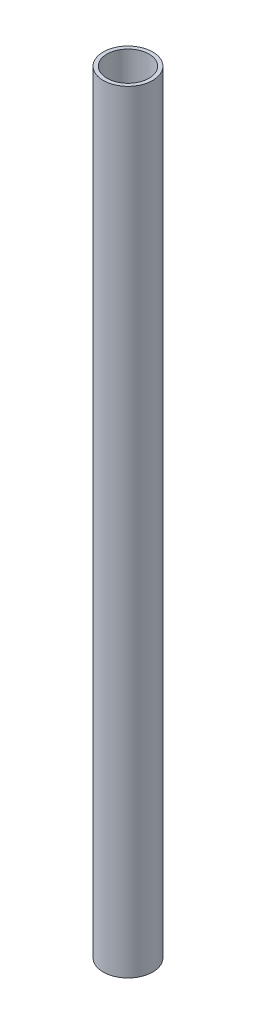
ISO-10303-21;
HEADER;
FILE_DESCRIPTION(('STEP AP214'),'2;1');
FILE_NAME('part.step','',(''),(''),'','','');
FILE_SCHEMA(('AUTOMOTIVE_DESIGN { 1 0 10303 214 1 1 1 1 }'));
ENDSEC;
DATA;
#1=APPLICATION_CONTEXT('core data for automotive mechanical design processes');
#2=APPLICATION_PROTOCOL_DEFINITION('international standard','automotive_design',2000,#1);
#3=PRODUCT_CONTEXT('',#1,'mechanical');
#4=PRODUCT('Part','Part','',(#3));
#5=PRODUCT_RELATED_PRODUCT_CATEGORY('part','',(#4));
#6=PRODUCT_DEFINITION_FORMATION('','',#4);
#7=PRODUCT_DEFINITION_CONTEXT('part definition',#1,'design');
#8=PRODUCT_DEFINITION('design','',#6,#7);
#9=PRODUCT_DEFINITION_SHAPE('','',#8);
#10=(LENGTH_UNIT() NAMED_UNIT(*) SI_UNIT(.MILLI.,.METRE.));
#11=(NAMED_UNIT(*) PLANE_ANGLE_UNIT() SI_UNIT($,.RADIAN.));
#12=(NAMED_UNIT(*) SI_UNIT($,.STERADIAN.) SOLID_ANGLE_UNIT());
#13=UNCERTAINTY_MEASURE_WITH_UNIT(LENGTH_MEASURE(1.E-05),#10,'distance_accuracy_value','');
#14=(GEOMETRIC_REPRESENTATION_CONTEXT(3) GLOBAL_UNCERTAINTY_ASSIGNED_CONTEXT((#13)) GLOBAL_UNIT_ASSIGNED_CONTEXT((#10,
#11,#12)) REPRESENTATION_CONTEXT('',''));
#15=CARTESIAN_POINT('',(0.,0.,0.));
#16=DIRECTION('',(0.,0.,1.));
#17=DIRECTION('',(1.,0.,0.));
#18=AXIS2_PLACEMENT_3D('',#15,#16,#17);
#19=CARTESIAN_POINT('',(0.,500.,0.));
#20=DIRECTION('',(0.,1.,0.));
#21=DIRECTION('',(0.,0.,1.));
#22=AXIS2_PLACEMENT_3D('',#19,#20,#21);
#23=PLANE('',#22);
#24=CARTESIAN_POINT('',(0.,500.,0.));
#25=DIRECTION('',(0.,1.,0.));
#26=DIRECTION('',(0.,0.,1.));
#27=AXIS2_PLACEMENT_3D('',#24,#25,#26);
#28=CIRCLE('',#27,16.);
#29=CARTESIAN_POINT('',(0.,500.,16.));
#30=VERTEX_POINT('',#29);
#31=EDGE_CURVE('E10',#30,#30,#28,.T.);
#32=ORIENTED_EDGE('',*,*,#31,.T.);
#33=EDGE_LOOP('',(#32));
#34=FACE_BOUND('',#33,.T.);
#35=CARTESIAN_POINT('',(0.,500.,0.));
#36=DIRECTION('',(0.,1.,0.));
#37=DIRECTION('',(0.,0.,1.));
#38=AXIS2_PLACEMENT_3D('',#35,#36,#37);
#39=CIRCLE('',#38,13.6);
#40=CARTESIAN_POINT('',(0.,500.,13.6));
#41=VERTEX_POINT('',#40);
#42=EDGE_CURVE('E48',#41,#41,#39,.T.);
#43=ORIENTED_EDGE('',*,*,#42,.F.);
#44=EDGE_LOOP('',(#43));
#45=FACE_BOUND('',#44,.T.);
#46=ADVANCED_FACE('F37',(#34,#45),#23,.T.);
#47=CARTESIAN_POINT('',(0.,0.,0.));
#48=DIRECTION('',(0.,1.,0.));
#49=DIRECTION('',(0.,0.,1.));
#50=AXIS2_PLACEMENT_3D('',#47,#48,#49);
#51=PLANE('',#50);
#52=CARTESIAN_POINT('',(0.,0.,0.));
#53=DIRECTION('',(0.,1.,0.));
#54=DIRECTION('',(0.,0.,1.));
#55=AXIS2_PLACEMENT_3D('',#52,#53,#54);
#56=CIRCLE('',#55,16.);
#57=CARTESIAN_POINT('',(0.,0.,16.));
#58=VERTEX_POINT('',#57);
#59=EDGE_CURVE('E41',#58,#58,#56,.T.);
#60=ORIENTED_EDGE('',*,*,#59,.F.);
#61=EDGE_LOOP('',(#60));
#62=FACE_BOUND('',#61,.T.);
#63=CARTESIAN_POINT('',(0.,0.,0.));
#64=DIRECTION('',(0.,1.,0.));
#65=DIRECTION('',(0.,0.,1.));
#66=AXIS2_PLACEMENT_3D('',#63,#64,#65);
#67=CIRCLE('',#66,13.6);
#68=CARTESIAN_POINT('',(0.,0.,13.6));
#69=VERTEX_POINT('',#68);
#70=EDGE_CURVE('E50',#69,#69,#67,.T.);
#71=ORIENTED_EDGE('',*,*,#70,.T.);
#72=EDGE_LOOP('',(#71));
#73=FACE_BOUND('',#72,.T.);
#74=ADVANCED_FACE('F60',(#62,#73),#51,.F.);
#75=CARTESIAN_POINT('',(0.,500.,0.));
#76=DIRECTION('',(0.,-1.,0.));
#77=DIRECTION('',(0.,0.,-1.));
#78=AXIS2_PLACEMENT_3D('',#75,#76,#77);
#79=CYLINDRICAL_SURFACE('',#78,16.);
#80=ORIENTED_EDGE('',*,*,#31,.F.);
#81=EDGE_LOOP('',(#80));
#82=FACE_BOUND('',#81,.T.);
#83=ORIENTED_EDGE('',*,*,#59,.T.);
#84=EDGE_LOOP('',(#83));
#85=FACE_BOUND('',#84,.T.);
#86=ADVANCED_FACE('F39',(#82,#85),#79,.T.);
#87=CARTESIAN_POINT('',(0.,500.,0.));
#88=DIRECTION('',(0.,-1.,0.));
#89=DIRECTION('',(0.,0.,-1.));
#90=AXIS2_PLACEMENT_3D('',#87,#88,#89);
#91=CYLINDRICAL_SURFACE('',#90,13.6);
#92=ORIENTED_EDGE('',*,*,#42,.T.);
#93=EDGE_LOOP('',(#92));
#94=FACE_BOUND('',#93,.T.);
#95=ORIENTED_EDGE('',*,*,#70,.F.);
#96=EDGE_LOOP('',(#95));
#97=FACE_BOUND('',#96,.T.);
#98=ADVANCED_FACE('F56',(#94,#97),#91,.F.);
#99=CLOSED_SHELL('',(#46,#74,#86,#98));
#100=MANIFOLD_SOLID_BREP('B2',#99);
#101=ADVANCED_BREP_SHAPE_REPRESENTATION('',(#18,#100),#14);
#102=SHAPE_DEFINITION_REPRESENTATION(#9,#101);
ENDSEC;
END-ISO-10303-21;
